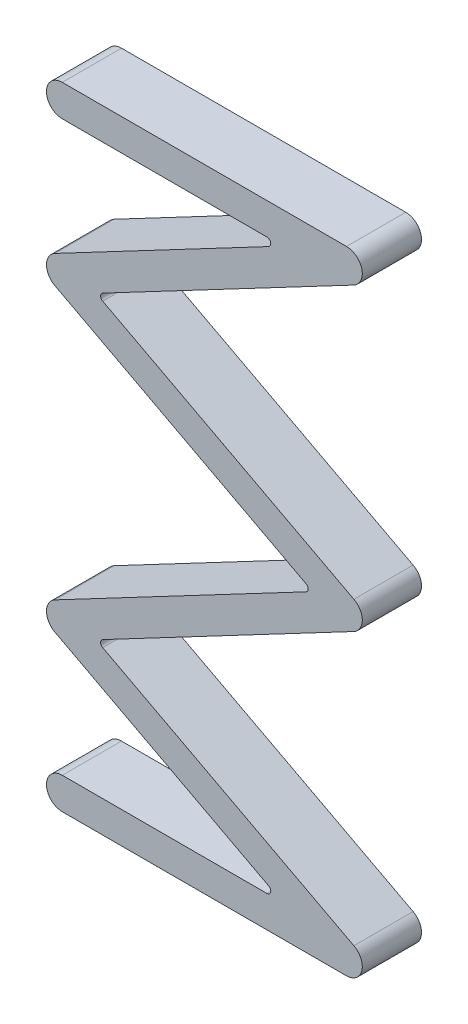
ISO-10303-21;
HEADER;
FILE_DESCRIPTION(('STEP AP214'),'2;1');
FILE_NAME('part.step','',(''),(''),'','','');
FILE_SCHEMA(('AUTOMOTIVE_DESIGN { 1 0 10303 214 1 1 1 1 }'));
ENDSEC;
DATA;
#1=APPLICATION_CONTEXT('core data for automotive mechanical design processes');
#2=APPLICATION_PROTOCOL_DEFINITION('international standard','automotive_design',2000,#1);
#3=PRODUCT_CONTEXT('',#1,'mechanical');
#4=PRODUCT('Part','Part','',(#3));
#5=PRODUCT_RELATED_PRODUCT_CATEGORY('part','',(#4));
#6=PRODUCT_DEFINITION_FORMATION('','',#4);
#7=PRODUCT_DEFINITION_CONTEXT('part definition',#1,'design');
#8=PRODUCT_DEFINITION('design','',#6,#7);
#9=PRODUCT_DEFINITION_SHAPE('','',#8);
#10=(LENGTH_UNIT() NAMED_UNIT(*) SI_UNIT(.MILLI.,.METRE.));
#11=(NAMED_UNIT(*) PLANE_ANGLE_UNIT() SI_UNIT($,.RADIAN.));
#12=(NAMED_UNIT(*) SI_UNIT($,.STERADIAN.) SOLID_ANGLE_UNIT());
#13=UNCERTAINTY_MEASURE_WITH_UNIT(LENGTH_MEASURE(1.E-05),#10,'distance_accuracy_value','');
#14=(GEOMETRIC_REPRESENTATION_CONTEXT(3) GLOBAL_UNCERTAINTY_ASSIGNED_CONTEXT((#13)) GLOBAL_UNIT_ASSIGNED_CONTEXT((#10,
#11,#12)) REPRESENTATION_CONTEXT('',''));
#15=CARTESIAN_POINT('',(0.,0.,0.));
#16=DIRECTION('',(0.,0.,1.));
#17=DIRECTION('',(1.,0.,0.));
#18=AXIS2_PLACEMENT_3D('',#15,#16,#17);
#19=CARTESIAN_POINT('',(0.4,15.6,1.5));
#20=DIRECTION('',(0.,0.,-1.));
#21=DIRECTION('',(-1.,0.,0.));
#22=AXIS2_PLACEMENT_3D('',#19,#20,#21);
#23=CYLINDRICAL_SURFACE('',#22,0.399999999999999);
#24=CARTESIAN_POINT('',(0.4,15.6,0.));
#25=DIRECTION('',(0.,0.,1.));
#26=DIRECTION('',(-1.,0.,0.));
#27=AXIS2_PLACEMENT_3D('',#24,#25,#26);
#28=CIRCLE('',#27,0.399999999999999);
#29=CARTESIAN_POINT('',(0.4,16.,0.));
#30=VERTEX_POINT('',#29);
#31=CARTESIAN_POINT('',(0.4,15.2,0.));
#32=VERTEX_POINT('',#31);
#33=EDGE_CURVE('E214',#30,#32,#28,.T.);
#34=ORIENTED_EDGE('',*,*,#33,.T.);
#35=DIRECTION('',(0.,0.,-1.));
#36=VECTOR('',#35,1.);
#37=CARTESIAN_POINT('',(0.4,15.2,1.5));
#38=LINE('',#37,#36);
#39=CARTESIAN_POINT('',(0.4,15.2,1.5));
#40=VERTEX_POINT('',#39);
#41=EDGE_CURVE('E196',#40,#32,#38,.T.);
#42=ORIENTED_EDGE('',*,*,#41,.F.);
#43=CARTESIAN_POINT('',(0.4,15.6,1.5));
#44=DIRECTION('',(0.,0.,1.));
#45=DIRECTION('',(-1.,0.,0.));
#46=AXIS2_PLACEMENT_3D('',#43,#44,#45);
#47=CIRCLE('',#46,0.399999999999999);
#48=CARTESIAN_POINT('',(0.4,16.,1.5));
#49=VERTEX_POINT('',#48);
#50=EDGE_CURVE('E201',#49,#40,#47,.T.);
#51=ORIENTED_EDGE('',*,*,#50,.F.);
#52=DIRECTION('',(0.,0.,-1.));
#53=VECTOR('',#52,1.);
#54=CARTESIAN_POINT('',(0.4,16.,1.5));
#55=LINE('',#54,#53);
#56=EDGE_CURVE('E368',#49,#30,#55,.T.);
#57=ORIENTED_EDGE('',*,*,#56,.T.);
#58=EDGE_LOOP('',(#34,#42,#51,#57));
#59=FACE_BOUND('',#58,.T.);
#60=ADVANCED_FACE('F35',(#59),#23,.T.);
#61=CARTESIAN_POINT('',(0.4,15.2,1.5));
#62=DIRECTION('',(0.,1.,0.));
#63=DIRECTION('',(0.,0.,1.));
#64=AXIS2_PLACEMENT_3D('',#61,#62,#63);
#65=PLANE('',#64);
#66=DIRECTION('',(1.,0.,0.));
#67=VECTOR('',#66,1.);
#68=CARTESIAN_POINT('',(0.4,15.2,0.));
#69=LINE('',#68,#67);
#70=CARTESIAN_POINT('',(5.58141408226065,15.2,0.));
#71=VERTEX_POINT('',#70);
#72=EDGE_CURVE('E344',#32,#71,#69,.T.);
#73=ORIENTED_EDGE('',*,*,#72,.T.);
#74=DIRECTION('',(0.,0.,-1.));
#75=VECTOR('',#74,1.);
#76=CARTESIAN_POINT('',(5.58141408226065,15.2,1.5));
#77=LINE('',#76,#75);
#78=CARTESIAN_POINT('',(5.58141408226065,15.2,1.5));
#79=VERTEX_POINT('',#78);
#80=EDGE_CURVE('E50',#71,#79,#77,.F.);
#81=ORIENTED_EDGE('',*,*,#80,.T.);
#82=DIRECTION('',(1.,0.,0.));
#83=VECTOR('',#82,1.);
#84=CARTESIAN_POINT('',(0.4,15.2,1.5));
#85=LINE('',#84,#83);
#86=EDGE_CURVE('E192',#40,#79,#85,.T.);
#87=ORIENTED_EDGE('',*,*,#86,.F.);
#88=ORIENTED_EDGE('',*,*,#41,.T.);
#89=EDGE_LOOP('',(#73,#81,#87,#88));
#90=FACE_BOUND('',#89,.T.);
#91=ADVANCED_FACE('F194',(#90),#65,.F.);
#92=CARTESIAN_POINT('',(5.98513126580852,15.2,1.5));
#93=DIRECTION('',(0.466758619558123,-0.884384752846969,0.));
#94=DIRECTION('',(0.88438475284697,0.466758619558123,0.));
#95=AXIS2_PLACEMENT_3D('',#92,#93,#94);
#96=PLANE('',#95);
#97=DIRECTION('',(-0.88438475284697,-0.466758619558123,0.));
#98=VECTOR('',#97,1.);
#99=CARTESIAN_POINT('',(5.98513126580852,15.2,1.5));
#100=LINE('',#99,#98);
#101=CARTESIAN_POINT('',(5.62808994421646,15.0115615247153,1.5));
#102=VERTEX_POINT('',#101);
#103=CARTESIAN_POINT('',(0.21329655217675,12.1537539011388,1.5));
#104=VERTEX_POINT('',#103);
#105=EDGE_CURVE('E200',#102,#104,#100,.T.);
#106=ORIENTED_EDGE('',*,*,#105,.F.);
#107=DIRECTION('',(0.,0.,-1.));
#108=VECTOR('',#107,1.);
#109=CARTESIAN_POINT('',(5.62808994421646,15.0115615247153,0.));
#110=LINE('',#109,#108);
#111=CARTESIAN_POINT('',(5.62808994421646,15.0115615247153,0.));
#112=VERTEX_POINT('',#111);
#113=EDGE_CURVE('E295',#102,#112,#110,.T.);
#114=ORIENTED_EDGE('',*,*,#113,.T.);
#115=DIRECTION('',(-0.88438475284697,-0.466758619558123,0.));
#116=VECTOR('',#115,1.);
#117=CARTESIAN_POINT('',(5.98513126580852,15.2,0.));
#118=LINE('',#117,#116);
#119=CARTESIAN_POINT('',(0.21329655217675,12.1537539011388,0.));
#120=VERTEX_POINT('',#119);
#121=EDGE_CURVE('E340',#112,#120,#118,.T.);
#122=ORIENTED_EDGE('',*,*,#121,.T.);
#123=DIRECTION('',(0.,0.,-1.));
#124=VECTOR('',#123,1.);
#125=CARTESIAN_POINT('',(0.213296552176752,12.1537539011388,1.5));
#126=LINE('',#125,#124);
#127=EDGE_CURVE('E266',#120,#104,#126,.F.);
#128=ORIENTED_EDGE('',*,*,#127,.T.);
#129=EDGE_LOOP('',(#106,#114,#122,#128));
#130=FACE_BOUND('',#129,.T.);
#131=ADVANCED_FACE('F409',(#130),#96,.F.);
#132=CARTESIAN_POINT('',(-0.456973997349374,11.8,1.5));
#133=DIRECTION('',(0.466758619558123,0.88438475284697,0.));
#134=DIRECTION('',(-0.88438475284697,0.466758619558123,0.));
#135=AXIS2_PLACEMENT_3D('',#132,#133,#134);
#136=PLANE('',#135);
#137=DIRECTION('',(0.88438475284697,-0.466758619558123,0.));
#138=VECTOR('',#137,1.);
#139=CARTESIAN_POINT('',(-0.456973997349374,11.8,0.));
#140=LINE('',#139,#138);
#141=CARTESIAN_POINT('',(0.21329655217675,11.4462460988612,0.));
#142=VERTEX_POINT('',#141);
#143=CARTESIAN_POINT('',(6.57545836526909,8.0884384752847,0.));
#144=VERTEX_POINT('',#143);
#145=EDGE_CURVE('E335',#142,#144,#140,.T.);
#146=ORIENTED_EDGE('',*,*,#145,.T.);
#147=DIRECTION('',(0.,0.,-1.));
#148=VECTOR('',#147,1.);
#149=CARTESIAN_POINT('',(6.5754583652691,8.0884384752847,1.5));
#150=LINE('',#149,#148);
#151=CARTESIAN_POINT('',(6.57545836526909,8.0884384752847,1.5));
#152=VERTEX_POINT('',#151);
#153=EDGE_CURVE('E293',#144,#152,#150,.F.);
#154=ORIENTED_EDGE('',*,*,#153,.T.);
#155=DIRECTION('',(0.88438475284697,-0.466758619558123,0.));
#156=VECTOR('',#155,1.);
#157=CARTESIAN_POINT('',(-0.456973997349374,11.8,1.5));
#158=LINE('',#157,#156);
#159=CARTESIAN_POINT('',(0.21329655217675,11.4462460988612,1.5));
#160=VERTEX_POINT('',#159);
#161=EDGE_CURVE('E319',#160,#152,#158,.T.);
#162=ORIENTED_EDGE('',*,*,#161,.F.);
#163=DIRECTION('',(0.,0.,-1.));
#164=VECTOR('',#163,1.);
#165=CARTESIAN_POINT('',(0.21329655217675,11.4462460988612,1.5));
#166=LINE('',#165,#164);
#167=EDGE_CURVE('E263',#160,#142,#166,.T.);
#168=ORIENTED_EDGE('',*,*,#167,.T.);
#169=EDGE_LOOP('',(#146,#154,#162,#168));
#170=FACE_BOUND('',#169,.T.);
#171=ADVANCED_FACE('F338',(#170),#136,.F.);
#172=CARTESIAN_POINT('',(6.74302600265063,8.,1.5));
#173=DIRECTION('',(0.466758619558123,-0.884384752846969,0.));
#174=DIRECTION('',(0.884384752846969,0.466758619558123,0.));
#175=AXIS2_PLACEMENT_3D('',#172,#173,#174);
#176=PLANE('',#175);
#177=DIRECTION('',(-0.884384752846969,-0.466758619558123,0.));
#178=VECTOR('',#177,1.);
#179=CARTESIAN_POINT('',(6.74302600265063,8.,1.5));
#180=LINE('',#179,#178);
#181=CARTESIAN_POINT('',(6.5754583652691,7.9115615247153,1.5));
#182=VERTEX_POINT('',#181);
#183=CARTESIAN_POINT('',(0.213296552176751,4.55375390113879,1.5));
#184=VERTEX_POINT('',#183);
#185=EDGE_CURVE('E317',#182,#184,#180,.T.);
#186=ORIENTED_EDGE('',*,*,#185,.F.);
#187=DIRECTION('',(0.,0.,-1.));
#188=VECTOR('',#187,1.);
#189=CARTESIAN_POINT('',(6.5754583652691,7.9115615247153,0.));
#190=LINE('',#189,#188);
#191=CARTESIAN_POINT('',(6.5754583652691,7.9115615247153,0.));
#192=VERTEX_POINT('',#191);
#193=EDGE_CURVE('E290',#182,#192,#190,.T.);
#194=ORIENTED_EDGE('',*,*,#193,.T.);
#195=DIRECTION('',(-0.884384752846969,-0.466758619558123,0.));
#196=VECTOR('',#195,1.);
#197=CARTESIAN_POINT('',(6.74302600265063,8.,0.));
#198=LINE('',#197,#196);
#199=CARTESIAN_POINT('',(0.213296552176751,4.55375390113879,0.));
#200=VERTEX_POINT('',#199);
#201=EDGE_CURVE('E336',#192,#200,#198,.T.);
#202=ORIENTED_EDGE('',*,*,#201,.T.);
#203=DIRECTION('',(0.,0.,-1.));
#204=VECTOR('',#203,1.);
#205=CARTESIAN_POINT('',(0.21329655217675,4.55375390113879,1.5));
#206=LINE('',#205,#204);
#207=EDGE_CURVE('E272',#200,#184,#206,.F.);
#208=ORIENTED_EDGE('',*,*,#207,.T.);
#209=EDGE_LOOP('',(#186,#194,#202,#208));
#210=FACE_BOUND('',#209,.T.);
#211=ADVANCED_FACE('F324',(#210),#176,.F.);
#212=CARTESIAN_POINT('',(-0.456973997349375,4.2,1.5));
#213=DIRECTION('',(0.466758619558123,0.88438475284697,0.));
#214=DIRECTION('',(-0.88438475284697,0.466758619558123,0.));
#215=AXIS2_PLACEMENT_3D('',#212,#213,#214);
#216=PLANE('',#215);
#217=DIRECTION('',(0.88438475284697,-0.466758619558123,0.));
#218=VECTOR('',#217,1.);
#219=CARTESIAN_POINT('',(-0.456973997349375,4.2,0.));
#220=LINE('',#219,#218);
#221=CARTESIAN_POINT('',(0.21329655217675,3.84624609886121,0.));
#222=VERTEX_POINT('',#221);
#223=CARTESIAN_POINT('',(5.62808994421646,0.988438475284696,0.));
#224=VERTEX_POINT('',#223);
#225=EDGE_CURVE('E342',#222,#224,#220,.T.);
#226=ORIENTED_EDGE('',*,*,#225,.T.);
#227=DIRECTION('',(0.,0.,-1.));
#228=VECTOR('',#227,1.);
#229=CARTESIAN_POINT('',(5.62808994421646,0.988438475284697,1.5));
#230=LINE('',#229,#228);
#231=CARTESIAN_POINT('',(5.62808994421646,0.988438475284696,1.5));
#232=VERTEX_POINT('',#231);
#233=EDGE_CURVE('E278',#224,#232,#230,.F.);
#234=ORIENTED_EDGE('',*,*,#233,.T.);
#235=DIRECTION('',(0.88438475284697,-0.466758619558123,0.));
#236=VECTOR('',#235,1.);
#237=CARTESIAN_POINT('',(-0.456973997349375,4.2,1.5));
#238=LINE('',#237,#236);
#239=CARTESIAN_POINT('',(0.21329655217675,3.84624609886121,1.5));
#240=VERTEX_POINT('',#239);
#241=EDGE_CURVE('E328',#240,#232,#238,.T.);
#242=ORIENTED_EDGE('',*,*,#241,.F.);
#243=DIRECTION('',(0.,0.,-1.));
#244=VECTOR('',#243,1.);
#245=CARTESIAN_POINT('',(0.21329655217675,3.84624609886121,1.5));
#246=LINE('',#245,#244);
#247=EDGE_CURVE('E269',#240,#222,#246,.T.);
#248=ORIENTED_EDGE('',*,*,#247,.T.);
#249=EDGE_LOOP('',(#226,#234,#242,#248));
#250=FACE_BOUND('',#249,.T.);
#251=ADVANCED_FACE('F428',(#250),#216,.F.);
#252=CARTESIAN_POINT('',(0.4,0.8,1.5));
#253=DIRECTION('',(0.,-1.,0.));
#254=DIRECTION('',(0.,0.,-1.));
#255=AXIS2_PLACEMENT_3D('',#252,#253,#254);
#256=PLANE('',#255);
#257=DIRECTION('',(-1.,0.,0.));
#258=VECTOR('',#257,1.);
#259=CARTESIAN_POINT('',(0.4,0.8,1.5));
#260=LINE('',#259,#258);
#261=CARTESIAN_POINT('',(5.58141408226065,0.8,1.5));
#262=VERTEX_POINT('',#261);
#263=CARTESIAN_POINT('',(0.4,0.8,1.5));
#264=VERTEX_POINT('',#263);
#265=EDGE_CURVE('E417',#262,#264,#260,.T.);
#266=ORIENTED_EDGE('',*,*,#265,.F.);
#267=DIRECTION('',(0.,0.,-1.));
#268=VECTOR('',#267,1.);
#269=CARTESIAN_POINT('',(5.58141408226065,0.8,0.));
#270=LINE('',#269,#268);
#271=CARTESIAN_POINT('',(5.58141408226065,0.8,0.));
#272=VERTEX_POINT('',#271);
#273=EDGE_CURVE('E275',#262,#272,#270,.T.);
#274=ORIENTED_EDGE('',*,*,#273,.T.);
#275=DIRECTION('',(-1.,0.,0.));
#276=VECTOR('',#275,1.);
#277=CARTESIAN_POINT('',(0.4,0.8,0.));
#278=LINE('',#277,#276);
#279=CARTESIAN_POINT('',(0.4,0.8,0.));
#280=VERTEX_POINT('',#279);
#281=EDGE_CURVE('E350',#272,#280,#278,.T.);
#282=ORIENTED_EDGE('',*,*,#281,.T.);
#283=DIRECTION('',(0.,0.,-1.));
#284=VECTOR('',#283,1.);
#285=CARTESIAN_POINT('',(0.4,0.8,1.5));
#286=LINE('',#285,#284);
#287=EDGE_CURVE('E216',#264,#280,#286,.T.);
#288=ORIENTED_EDGE('',*,*,#287,.F.);
#289=EDGE_LOOP('',(#266,#274,#282,#288));
#290=FACE_BOUND('',#289,.T.);
#291=ADVANCED_FACE('F422',(#290),#256,.F.);
#292=CARTESIAN_POINT('',(0.4,0.4,1.5));
#293=DIRECTION('',(0.,0.,-1.));
#294=DIRECTION('',(-1.,0.,0.));
#295=AXIS2_PLACEMENT_3D('',#292,#293,#294);
#296=CYLINDRICAL_SURFACE('',#295,0.4);
#297=CARTESIAN_POINT('',(0.4,0.4,0.));
#298=DIRECTION('',(0.,0.,1.));
#299=DIRECTION('',(1.,0.,0.));
#300=AXIS2_PLACEMENT_3D('',#297,#298,#299);
#301=CIRCLE('',#300,0.4);
#302=CARTESIAN_POINT('',(0.4,0.,0.));
#303=VERTEX_POINT('',#302);
#304=EDGE_CURVE('E352',#280,#303,#301,.T.);
#305=ORIENTED_EDGE('',*,*,#304,.T.);
#306=DIRECTION('',(0.,0.,-1.));
#307=VECTOR('',#306,1.);
#308=CARTESIAN_POINT('',(0.4,0.,1.5));
#309=LINE('',#308,#307);
#310=CARTESIAN_POINT('',(0.4,0.,1.5));
#311=VERTEX_POINT('',#310);
#312=EDGE_CURVE('E222',#311,#303,#309,.T.);
#313=ORIENTED_EDGE('',*,*,#312,.F.);
#314=CARTESIAN_POINT('',(0.4,0.4,1.5));
#315=DIRECTION('',(0.,0.,1.));
#316=DIRECTION('',(1.,0.,0.));
#317=AXIS2_PLACEMENT_3D('',#314,#315,#316);
#318=CIRCLE('',#317,0.4);
#319=EDGE_CURVE('E396',#264,#311,#318,.T.);
#320=ORIENTED_EDGE('',*,*,#319,.F.);
#321=ORIENTED_EDGE('',*,*,#287,.T.);
#322=EDGE_LOOP('',(#305,#313,#320,#321));
#323=FACE_BOUND('',#322,.T.);
#324=ADVANCED_FACE('F420',(#323),#296,.T.);
#325=CARTESIAN_POINT('',(0.4,0.,1.5));
#326=DIRECTION('',(0.,1.,0.));
#327=DIRECTION('',(0.,0.,1.));
#328=AXIS2_PLACEMENT_3D('',#325,#326,#327);
#329=PLANE('',#328);
#330=DIRECTION('',(1.,0.,0.));
#331=VECTOR('',#330,1.);
#332=CARTESIAN_POINT('',(0.4,0.,0.));
#333=LINE('',#332,#331);
#334=CARTESIAN_POINT('',(7.6,0.,0.));
#335=VERTEX_POINT('',#334);
#336=EDGE_CURVE('E354',#303,#335,#333,.T.);
#337=ORIENTED_EDGE('',*,*,#336,.T.);
#338=DIRECTION('',(0.,0.,-1.));
#339=VECTOR('',#338,1.);
#340=CARTESIAN_POINT('',(7.6,0.,1.5));
#341=LINE('',#340,#339);
#342=CARTESIAN_POINT('',(7.6,0.,1.5));
#343=VERTEX_POINT('',#342);
#344=EDGE_CURVE('E239',#335,#343,#341,.F.);
#345=ORIENTED_EDGE('',*,*,#344,.T.);
#346=DIRECTION('',(1.,0.,0.));
#347=VECTOR('',#346,1.);
#348=CARTESIAN_POINT('',(0.4,0.,1.5));
#349=LINE('',#348,#347);
#350=EDGE_CURVE('E376',#311,#343,#349,.T.);
#351=ORIENTED_EDGE('',*,*,#350,.F.);
#352=ORIENTED_EDGE('',*,*,#312,.T.);
#353=EDGE_LOOP('',(#337,#345,#351,#352));
#354=FACE_BOUND('',#353,.T.);
#355=ADVANCED_FACE('F374',(#354),#329,.F.);
#356=CARTESIAN_POINT('',(1.25697399734937,4.2,1.5));
#357=DIRECTION('',(-0.466758619558123,-0.88438475284697,0.));
#358=DIRECTION('',(0.88438475284697,-0.466758619558123,0.));
#359=AXIS2_PLACEMENT_3D('',#356,#357,#358);
#360=PLANE('',#359);
#361=DIRECTION('',(-0.88438475284697,0.466758619558123,0.));
#362=VECTOR('',#361,1.);
#363=CARTESIAN_POINT('',(1.25697399734937,4.2,0.));
#364=LINE('',#363,#362);
#365=CARTESIAN_POINT('',(7.78670344782325,0.753753901138788,0.));
#366=VERTEX_POINT('',#365);
#367=CARTESIAN_POINT('',(1.4245416347309,4.1115615247153,0.));
#368=VERTEX_POINT('',#367);
#369=EDGE_CURVE('E357',#366,#368,#364,.T.);
#370=ORIENTED_EDGE('',*,*,#369,.T.);
#371=DIRECTION('',(0.,0.,-1.));
#372=VECTOR('',#371,1.);
#373=CARTESIAN_POINT('',(1.4245416347309,4.1115615247153,1.5));
#374=LINE('',#373,#372);
#375=CARTESIAN_POINT('',(1.4245416347309,4.1115615247153,1.5));
#376=VERTEX_POINT('',#375);
#377=EDGE_CURVE('E283',#368,#376,#374,.F.);
#378=ORIENTED_EDGE('',*,*,#377,.T.);
#379=DIRECTION('',(-0.88438475284697,0.466758619558123,0.));
#380=VECTOR('',#379,1.);
#381=CARTESIAN_POINT('',(1.25697399734937,4.2,1.5));
#382=LINE('',#381,#380);
#383=CARTESIAN_POINT('',(7.78670344782325,0.753753901138788,1.5));
#384=VERTEX_POINT('',#383);
#385=EDGE_CURVE('E390',#384,#376,#382,.T.);
#386=ORIENTED_EDGE('',*,*,#385,.F.);
#387=DIRECTION('',(0.,0.,-1.));
#388=VECTOR('',#387,1.);
#389=CARTESIAN_POINT('',(7.78670344782325,0.753753901138788,1.5));
#390=LINE('',#389,#388);
#391=EDGE_CURVE('E215',#384,#366,#390,.T.);
#392=ORIENTED_EDGE('',*,*,#391,.T.);
#393=EDGE_LOOP('',(#370,#378,#386,#392));
#394=FACE_BOUND('',#393,.T.);
#395=ADVANCED_FACE('F387',(#394),#360,.F.);
#396=CARTESIAN_POINT('',(8.45697399734938,8.,1.5));
#397=DIRECTION('',(-0.466758619558123,0.884384752846969,0.));
#398=DIRECTION('',(-0.884384752846969,-0.466758619558123,0.));
#399=AXIS2_PLACEMENT_3D('',#396,#397,#398);
#400=PLANE('',#399);
#401=DIRECTION('',(0.88438475284697,0.466758619558123,0.));
#402=VECTOR('',#401,1.);
#403=CARTESIAN_POINT('',(8.45697399734938,8.,1.5));
#404=LINE('',#403,#402);
#405=CARTESIAN_POINT('',(1.4245416347309,4.28843847528469,1.5));
#406=VERTEX_POINT('',#405);
#407=CARTESIAN_POINT('',(7.78670344782325,7.64624609886121,1.5));
#408=VERTEX_POINT('',#407);
#409=EDGE_CURVE('E392',#406,#408,#404,.T.);
#410=ORIENTED_EDGE('',*,*,#409,.F.);
#411=DIRECTION('',(0.,0.,-1.));
#412=VECTOR('',#411,1.);
#413=CARTESIAN_POINT('',(1.4245416347309,4.28843847528469,0.));
#414=LINE('',#413,#412);
#415=CARTESIAN_POINT('',(1.4245416347309,4.28843847528469,0.));
#416=VERTEX_POINT('',#415);
#417=EDGE_CURVE('E280',#406,#416,#414,.T.);
#418=ORIENTED_EDGE('',*,*,#417,.T.);
#419=DIRECTION('',(0.88438475284697,0.466758619558123,0.));
#420=VECTOR('',#419,1.);
#421=CARTESIAN_POINT('',(8.45697399734938,8.,0.));
#422=LINE('',#421,#420);
#423=CARTESIAN_POINT('',(7.78670344782325,7.64624609886121,0.));
#424=VERTEX_POINT('',#423);
#425=EDGE_CURVE('E360',#416,#424,#422,.T.);
#426=ORIENTED_EDGE('',*,*,#425,.T.);
#427=DIRECTION('',(0.,0.,-1.));
#428=VECTOR('',#427,1.);
#429=CARTESIAN_POINT('',(7.78670344782325,7.64624609886121,1.5));
#430=LINE('',#429,#428);
#431=EDGE_CURVE('E254',#424,#408,#430,.F.);
#432=ORIENTED_EDGE('',*,*,#431,.T.);
#433=EDGE_LOOP('',(#410,#418,#426,#432));
#434=FACE_BOUND('',#433,.T.);
#435=ADVANCED_FACE('F490',(#434),#400,.F.);
#436=CARTESIAN_POINT('',(1.25697399734937,11.8,1.5));
#437=DIRECTION('',(-0.466758619558123,-0.88438475284697,0.));
#438=DIRECTION('',(0.88438475284697,-0.466758619558123,0.));
#439=AXIS2_PLACEMENT_3D('',#436,#437,#438);
#440=PLANE('',#439);
#441=DIRECTION('',(-0.88438475284697,0.466758619558123,0.));
#442=VECTOR('',#441,1.);
#443=CARTESIAN_POINT('',(1.25697399734937,11.8,0.));
#444=LINE('',#443,#442);
#445=CARTESIAN_POINT('',(7.78670344782325,8.35375390113879,0.));
#446=VERTEX_POINT('',#445);
#447=CARTESIAN_POINT('',(1.4245416347309,11.7115615247153,0.));
#448=VERTEX_POINT('',#447);
#449=EDGE_CURVE('E362',#446,#448,#444,.T.);
#450=ORIENTED_EDGE('',*,*,#449,.T.);
#451=DIRECTION('',(0.,0.,-1.));
#452=VECTOR('',#451,1.);
#453=CARTESIAN_POINT('',(1.4245416347309,11.7115615247153,1.5));
#454=LINE('',#453,#452);
#455=CARTESIAN_POINT('',(1.4245416347309,11.7115615247153,1.5));
#456=VERTEX_POINT('',#455);
#457=EDGE_CURVE('E288',#448,#456,#454,.F.);
#458=ORIENTED_EDGE('',*,*,#457,.T.);
#459=DIRECTION('',(-0.88438475284697,0.466758619558123,0.));
#460=VECTOR('',#459,1.);
#461=CARTESIAN_POINT('',(1.25697399734937,11.8,1.5));
#462=LINE('',#461,#460);
#463=CARTESIAN_POINT('',(7.78670344782325,8.35375390113879,1.5));
#464=VERTEX_POINT('',#463);
#465=EDGE_CURVE('E394',#464,#456,#462,.T.);
#466=ORIENTED_EDGE('',*,*,#465,.F.);
#467=DIRECTION('',(0.,0.,-1.));
#468=VECTOR('',#467,1.);
#469=CARTESIAN_POINT('',(7.78670344782325,8.35375390113879,1.5));
#470=LINE('',#469,#468);
#471=EDGE_CURVE('E251',#464,#446,#470,.T.);
#472=ORIENTED_EDGE('',*,*,#471,.T.);
#473=EDGE_LOOP('',(#450,#458,#466,#472));
#474=FACE_BOUND('',#473,.T.);
#475=ADVANCED_FACE('F483',(#474),#440,.F.);
#476=CARTESIAN_POINT('',(9.21486873419147,16.,1.5));
#477=DIRECTION('',(-0.466758619558123,0.884384752846969,0.));
#478=DIRECTION('',(-0.88438475284697,-0.466758619558123,0.));
#479=AXIS2_PLACEMENT_3D('',#476,#477,#478);
#480=PLANE('',#479);
#481=DIRECTION('',(0.88438475284697,0.466758619558123,0.));
#482=VECTOR('',#481,1.);
#483=CARTESIAN_POINT('',(9.21486873419147,16.,1.5));
#484=LINE('',#483,#482);
#485=CARTESIAN_POINT('',(1.4245416347309,11.8884384752847,1.5));
#486=VERTEX_POINT('',#485);
#487=CARTESIAN_POINT('',(7.78670344782325,15.2462460988612,1.5));
#488=VERTEX_POINT('',#487);
#489=EDGE_CURVE('E402',#486,#488,#484,.T.);
#490=ORIENTED_EDGE('',*,*,#489,.F.);
#491=DIRECTION('',(0.,0.,-1.));
#492=VECTOR('',#491,1.);
#493=CARTESIAN_POINT('',(1.4245416347309,11.8884384752847,0.));
#494=LINE('',#493,#492);
#495=CARTESIAN_POINT('',(1.4245416347309,11.8884384752847,0.));
#496=VERTEX_POINT('',#495);
#497=EDGE_CURVE('E285',#486,#496,#494,.T.);
#498=ORIENTED_EDGE('',*,*,#497,.T.);
#499=DIRECTION('',(0.88438475284697,0.466758619558123,0.));
#500=VECTOR('',#499,1.);
#501=CARTESIAN_POINT('',(9.21486873419147,16.,0.));
#502=LINE('',#501,#500);
#503=CARTESIAN_POINT('',(7.78670344782325,15.2462460988612,0.));
#504=VERTEX_POINT('',#503);
#505=EDGE_CURVE('E365',#496,#504,#502,.T.);
#506=ORIENTED_EDGE('',*,*,#505,.T.);
#507=DIRECTION('',(0.,0.,-1.));
#508=VECTOR('',#507,1.);
#509=CARTESIAN_POINT('',(7.78670344782325,15.2462460988612,1.5));
#510=LINE('',#509,#508);
#511=EDGE_CURVE('E260',#504,#488,#510,.F.);
#512=ORIENTED_EDGE('',*,*,#511,.T.);
#513=EDGE_LOOP('',(#490,#498,#506,#512));
#514=FACE_BOUND('',#513,.T.);
#515=ADVANCED_FACE('F475',(#514),#480,.F.);
#516=CARTESIAN_POINT('',(0.4,16.,1.5));
#517=DIRECTION('',(0.,-1.,0.));
#518=DIRECTION('',(0.,0.,-1.));
#519=AXIS2_PLACEMENT_3D('',#516,#517,#518);
#520=PLANE('',#519);
#521=DIRECTION('',(-1.,0.,0.));
#522=VECTOR('',#521,1.);
#523=CARTESIAN_POINT('',(0.4,16.,1.5));
#524=LINE('',#523,#522);
#525=CARTESIAN_POINT('',(7.6,16.,1.5));
#526=VERTEX_POINT('',#525);
#527=EDGE_CURVE('E207',#526,#49,#524,.T.);
#528=ORIENTED_EDGE('',*,*,#527,.F.);
#529=DIRECTION('',(0.,0.,-1.));
#530=VECTOR('',#529,1.);
#531=CARTESIAN_POINT('',(7.6,16.,1.5));
#532=LINE('',#531,#530);
#533=CARTESIAN_POINT('',(7.6,16.,0.));
#534=VERTEX_POINT('',#533);
#535=EDGE_CURVE('E257',#526,#534,#532,.T.);
#536=ORIENTED_EDGE('',*,*,#535,.T.);
#537=DIRECTION('',(-1.,0.,0.));
#538=VECTOR('',#537,1.);
#539=CARTESIAN_POINT('',(0.4,16.,0.));
#540=LINE('',#539,#538);
#541=EDGE_CURVE('E211',#534,#30,#540,.T.);
#542=ORIENTED_EDGE('',*,*,#541,.T.);
#543=ORIENTED_EDGE('',*,*,#56,.F.);
#544=EDGE_LOOP('',(#528,#536,#542,#543));
#545=FACE_BOUND('',#544,.T.);
#546=ADVANCED_FACE('F470',(#545),#520,.F.);
#547=CARTESIAN_POINT('',(0.4,15.6,1.5));
#548=DIRECTION('',(0.,0.,-1.));
#549=DIRECTION('',(-1.,0.,0.));
#550=AXIS2_PLACEMENT_3D('',#547,#548,#549);
#551=PLANE('',#550);
#552=ORIENTED_EDGE('',*,*,#350,.T.);
#553=CARTESIAN_POINT('',(7.6,0.4,1.5));
#554=DIRECTION('',(0.,0.,-1.));
#555=DIRECTION('',(-1.,0.,0.));
#556=AXIS2_PLACEMENT_3D('',#553,#554,#555);
#557=CIRCLE('',#556,0.4);
#558=EDGE_CURVE('E249',#343,#384,#557,.F.);
#559=ORIENTED_EDGE('',*,*,#558,.T.);
#560=ORIENTED_EDGE('',*,*,#385,.T.);
#561=CARTESIAN_POINT('',(1.47121749668672,4.2,1.5));
#562=DIRECTION('',(0.,0.,-1.));
#563=DIRECTION('',(-1.,0.,0.));
#564=AXIS2_PLACEMENT_3D('',#561,#562,#563);
#565=CIRCLE('',#564,0.1);
#566=EDGE_CURVE('E305',#376,#406,#565,.T.);
#567=ORIENTED_EDGE('',*,*,#566,.T.);
#568=ORIENTED_EDGE('',*,*,#409,.T.);
#569=CARTESIAN_POINT('',(7.6,8.,1.5));
#570=DIRECTION('',(0.,0.,-1.));
#571=DIRECTION('',(-1.,0.,0.));
#572=AXIS2_PLACEMENT_3D('',#569,#570,#571);
#573=CIRCLE('',#572,0.4);
#574=EDGE_CURVE('E247',#408,#464,#573,.F.);
#575=ORIENTED_EDGE('',*,*,#574,.T.);
#576=ORIENTED_EDGE('',*,*,#465,.T.);
#577=CARTESIAN_POINT('',(1.47121749668671,11.8,1.5));
#578=DIRECTION('',(0.,0.,-1.));
#579=DIRECTION('',(-1.,0.,0.));
#580=AXIS2_PLACEMENT_3D('',#577,#578,#579);
#581=CIRCLE('',#580,0.1);
#582=EDGE_CURVE('E309',#456,#486,#581,.T.);
#583=ORIENTED_EDGE('',*,*,#582,.T.);
#584=ORIENTED_EDGE('',*,*,#489,.T.);
#585=CARTESIAN_POINT('',(7.6,15.6,1.5));
#586=DIRECTION('',(0.,0.,-1.));
#587=DIRECTION('',(-1.,0.,0.));
#588=AXIS2_PLACEMENT_3D('',#585,#586,#587);
#589=CIRCLE('',#588,0.4);
#590=EDGE_CURVE('E245',#488,#526,#589,.F.);
#591=ORIENTED_EDGE('',*,*,#590,.T.);
#592=ORIENTED_EDGE('',*,*,#527,.T.);
#593=ORIENTED_EDGE('',*,*,#50,.T.);
#594=ORIENTED_EDGE('',*,*,#86,.T.);
#595=CARTESIAN_POINT('',(5.58141408226065,15.1,1.5));
#596=DIRECTION('',(0.,0.,-1.));
#597=DIRECTION('',(-1.,0.,0.));
#598=AXIS2_PLACEMENT_3D('',#595,#596,#597);
#599=CIRCLE('',#598,0.1);
#600=EDGE_CURVE('E11',#79,#102,#599,.T.);
#601=ORIENTED_EDGE('',*,*,#600,.T.);
#602=ORIENTED_EDGE('',*,*,#105,.T.);
#603=CARTESIAN_POINT('',(0.4,11.8,1.5));
#604=DIRECTION('',(0.,0.,-1.));
#605=DIRECTION('',(-1.,0.,0.));
#606=AXIS2_PLACEMENT_3D('',#603,#604,#605);
#607=CIRCLE('',#606,0.4);
#608=EDGE_CURVE('E243',#104,#160,#607,.F.);
#609=ORIENTED_EDGE('',*,*,#608,.T.);
#610=ORIENTED_EDGE('',*,*,#161,.T.);
#611=CARTESIAN_POINT('',(6.52878250331328,8.,1.5));
#612=DIRECTION('',(0.,0.,-1.));
#613=DIRECTION('',(-1.,0.,0.));
#614=AXIS2_PLACEMENT_3D('',#611,#612,#613);
#615=CIRCLE('',#614,0.1);
#616=EDGE_CURVE('E313',#152,#182,#615,.T.);
#617=ORIENTED_EDGE('',*,*,#616,.T.);
#618=ORIENTED_EDGE('',*,*,#185,.T.);
#619=CARTESIAN_POINT('',(0.399999999999999,4.2,1.5));
#620=DIRECTION('',(0.,0.,-1.));
#621=DIRECTION('',(-1.,0.,0.));
#622=AXIS2_PLACEMENT_3D('',#619,#620,#621);
#623=CIRCLE('',#622,0.4);
#624=EDGE_CURVE('E241',#184,#240,#623,.F.);
#625=ORIENTED_EDGE('',*,*,#624,.T.);
#626=ORIENTED_EDGE('',*,*,#241,.T.);
#627=CARTESIAN_POINT('',(5.58141408226065,0.9,1.5));
#628=DIRECTION('',(0.,0.,-1.));
#629=DIRECTION('',(-1.,0.,0.));
#630=AXIS2_PLACEMENT_3D('',#627,#628,#629);
#631=CIRCLE('',#630,0.1);
#632=EDGE_CURVE('E301',#232,#262,#631,.T.);
#633=ORIENTED_EDGE('',*,*,#632,.T.);
#634=ORIENTED_EDGE('',*,*,#265,.T.);
#635=ORIENTED_EDGE('',*,*,#319,.T.);
#636=EDGE_LOOP('',(#552,#559,#560,#567,#568,#575,#576,#583,#584,#591,#592,#593,#594,#601,#602,
#609,#610,#617,#618,#625,#626,#633,#634,#635));
#637=FACE_BOUND('',#636,.T.);
#638=ADVANCED_FACE('F205',(#637),#551,.F.);
#639=CARTESIAN_POINT('',(0.4,15.6,0.));
#640=DIRECTION('',(0.,0.,-1.));
#641=DIRECTION('',(-1.,0.,0.));
#642=AXIS2_PLACEMENT_3D('',#639,#640,#641);
#643=PLANE('',#642);
#644=ORIENTED_EDGE('',*,*,#369,.F.);
#645=CARTESIAN_POINT('',(7.6,0.4,0.));
#646=DIRECTION('',(0.,0.,-1.));
#647=DIRECTION('',(-1.,0.,0.));
#648=AXIS2_PLACEMENT_3D('',#645,#646,#647);
#649=CIRCLE('',#648,0.4);
#650=EDGE_CURVE('E237',#366,#335,#649,.T.);
#651=ORIENTED_EDGE('',*,*,#650,.T.);
#652=ORIENTED_EDGE('',*,*,#336,.F.);
#653=ORIENTED_EDGE('',*,*,#304,.F.);
#654=ORIENTED_EDGE('',*,*,#281,.F.);
#655=CARTESIAN_POINT('',(5.58141408226065,0.9,0.));
#656=DIRECTION('',(0.,0.,-1.));
#657=DIRECTION('',(-1.,0.,0.));
#658=AXIS2_PLACEMENT_3D('',#655,#656,#657);
#659=CIRCLE('',#658,0.1);
#660=EDGE_CURVE('E299',#272,#224,#659,.F.);
#661=ORIENTED_EDGE('',*,*,#660,.T.);
#662=ORIENTED_EDGE('',*,*,#225,.F.);
#663=CARTESIAN_POINT('',(0.399999999999999,4.2,0.));
#664=DIRECTION('',(0.,0.,-1.));
#665=DIRECTION('',(-1.,0.,0.));
#666=AXIS2_PLACEMENT_3D('',#663,#664,#665);
#667=CIRCLE('',#666,0.4);
#668=EDGE_CURVE('E219',#222,#200,#667,.T.);
#669=ORIENTED_EDGE('',*,*,#668,.T.);
#670=ORIENTED_EDGE('',*,*,#201,.F.);
#671=CARTESIAN_POINT('',(6.52878250331328,8.,0.));
#672=DIRECTION('',(0.,0.,-1.));
#673=DIRECTION('',(-1.,0.,0.));
#674=AXIS2_PLACEMENT_3D('',#671,#672,#673);
#675=CIRCLE('',#674,0.1);
#676=EDGE_CURVE('E311',#192,#144,#675,.F.);
#677=ORIENTED_EDGE('',*,*,#676,.T.);
#678=ORIENTED_EDGE('',*,*,#145,.F.);
#679=CARTESIAN_POINT('',(0.4,11.8,0.));
#680=DIRECTION('',(0.,0.,-1.));
#681=DIRECTION('',(-1.,0.,0.));
#682=AXIS2_PLACEMENT_3D('',#679,#680,#681);
#683=CIRCLE('',#682,0.4);
#684=EDGE_CURVE('E228',#142,#120,#683,.T.);
#685=ORIENTED_EDGE('',*,*,#684,.T.);
#686=ORIENTED_EDGE('',*,*,#121,.F.);
#687=CARTESIAN_POINT('',(5.58141408226065,15.1,0.));
#688=DIRECTION('',(0.,0.,-1.));
#689=DIRECTION('',(-1.,0.,0.));
#690=AXIS2_PLACEMENT_3D('',#687,#688,#689);
#691=CIRCLE('',#690,0.1);
#692=EDGE_CURVE('E43',#112,#71,#691,.F.);
#693=ORIENTED_EDGE('',*,*,#692,.T.);
#694=ORIENTED_EDGE('',*,*,#72,.F.);
#695=ORIENTED_EDGE('',*,*,#33,.F.);
#696=ORIENTED_EDGE('',*,*,#541,.F.);
#697=CARTESIAN_POINT('',(7.6,15.6,0.));
#698=DIRECTION('',(0.,0.,-1.));
#699=DIRECTION('',(-1.,0.,0.));
#700=AXIS2_PLACEMENT_3D('',#697,#698,#699);
#701=CIRCLE('',#700,0.4);
#702=EDGE_CURVE('E231',#534,#504,#701,.T.);
#703=ORIENTED_EDGE('',*,*,#702,.T.);
#704=ORIENTED_EDGE('',*,*,#505,.F.);
#705=CARTESIAN_POINT('',(1.47121749668671,11.8,0.));
#706=DIRECTION('',(0.,0.,-1.));
#707=DIRECTION('',(-1.,0.,0.));
#708=AXIS2_PLACEMENT_3D('',#705,#706,#707);
#709=CIRCLE('',#708,0.1);
#710=EDGE_CURVE('E307',#496,#448,#709,.F.);
#711=ORIENTED_EDGE('',*,*,#710,.T.);
#712=ORIENTED_EDGE('',*,*,#449,.F.);
#713=CARTESIAN_POINT('',(7.6,8.,0.));
#714=DIRECTION('',(0.,0.,-1.));
#715=DIRECTION('',(-1.,0.,0.));
#716=AXIS2_PLACEMENT_3D('',#713,#714,#715);
#717=CIRCLE('',#716,0.4);
#718=EDGE_CURVE('E234',#446,#424,#717,.T.);
#719=ORIENTED_EDGE('',*,*,#718,.T.);
#720=ORIENTED_EDGE('',*,*,#425,.F.);
#721=CARTESIAN_POINT('',(1.47121749668672,4.2,0.));
#722=DIRECTION('',(0.,0.,-1.));
#723=DIRECTION('',(-1.,0.,0.));
#724=AXIS2_PLACEMENT_3D('',#721,#722,#723);
#725=CIRCLE('',#724,0.1);
#726=EDGE_CURVE('E303',#416,#368,#725,.F.);
#727=ORIENTED_EDGE('',*,*,#726,.T.);
#728=EDGE_LOOP('',(#644,#651,#652,#653,#654,#661,#662,#669,#670,#677,#678,#685,#686,#693,#694,
#695,#696,#703,#704,#711,#712,#719,#720,#727));
#729=FACE_BOUND('',#728,.T.);
#730=ADVANCED_FACE('F334',(#729),#643,.T.);
#731=CARTESIAN_POINT('',(7.6,0.4,1.5));
#732=DIRECTION('',(0.,0.,-1.));
#733=DIRECTION('',(-1.,0.,0.));
#734=AXIS2_PLACEMENT_3D('',#731,#732,#733);
#735=CYLINDRICAL_SURFACE('',#734,0.4);
#736=ORIENTED_EDGE('',*,*,#558,.F.);
#737=ORIENTED_EDGE('',*,*,#344,.F.);
#738=ORIENTED_EDGE('',*,*,#650,.F.);
#739=ORIENTED_EDGE('',*,*,#391,.F.);
#740=EDGE_LOOP('',(#736,#737,#738,#739));
#741=FACE_BOUND('',#740,.T.);
#742=ADVANCED_FACE('F384',(#741),#735,.T.);
#743=CARTESIAN_POINT('',(7.6,8.,1.5));
#744=DIRECTION('',(0.,0.,-1.));
#745=DIRECTION('',(-1.,0.,0.));
#746=AXIS2_PLACEMENT_3D('',#743,#744,#745);
#747=CYLINDRICAL_SURFACE('',#746,0.4);
#748=ORIENTED_EDGE('',*,*,#574,.F.);
#749=ORIENTED_EDGE('',*,*,#431,.F.);
#750=ORIENTED_EDGE('',*,*,#718,.F.);
#751=ORIENTED_EDGE('',*,*,#471,.F.);
#752=EDGE_LOOP('',(#748,#749,#750,#751));
#753=FACE_BOUND('',#752,.T.);
#754=ADVANCED_FACE('F457',(#753),#747,.T.);
#755=CARTESIAN_POINT('',(7.6,15.6,1.5));
#756=DIRECTION('',(0.,0.,-1.));
#757=DIRECTION('',(-1.,0.,0.));
#758=AXIS2_PLACEMENT_3D('',#755,#756,#757);
#759=CYLINDRICAL_SURFACE('',#758,0.4);
#760=ORIENTED_EDGE('',*,*,#590,.F.);
#761=ORIENTED_EDGE('',*,*,#511,.F.);
#762=ORIENTED_EDGE('',*,*,#702,.F.);
#763=ORIENTED_EDGE('',*,*,#535,.F.);
#764=EDGE_LOOP('',(#760,#761,#762,#763));
#765=FACE_BOUND('',#764,.T.);
#766=ADVANCED_FACE('F444',(#765),#759,.T.);
#767=CARTESIAN_POINT('',(0.4,11.8,1.5));
#768=DIRECTION('',(0.,0.,-1.));
#769=DIRECTION('',(-1.,0.,0.));
#770=AXIS2_PLACEMENT_3D('',#767,#768,#769);
#771=CYLINDRICAL_SURFACE('',#770,0.4);
#772=ORIENTED_EDGE('',*,*,#608,.F.);
#773=ORIENTED_EDGE('',*,*,#127,.F.);
#774=ORIENTED_EDGE('',*,*,#684,.F.);
#775=ORIENTED_EDGE('',*,*,#167,.F.);
#776=EDGE_LOOP('',(#772,#773,#774,#775));
#777=FACE_BOUND('',#776,.T.);
#778=ADVANCED_FACE('F436',(#777),#771,.T.);
#779=CARTESIAN_POINT('',(0.399999999999999,4.2,1.5));
#780=DIRECTION('',(0.,0.,-1.));
#781=DIRECTION('',(-1.,0.,0.));
#782=AXIS2_PLACEMENT_3D('',#779,#780,#781);
#783=CYLINDRICAL_SURFACE('',#782,0.4);
#784=ORIENTED_EDGE('',*,*,#624,.F.);
#785=ORIENTED_EDGE('',*,*,#207,.F.);
#786=ORIENTED_EDGE('',*,*,#668,.F.);
#787=ORIENTED_EDGE('',*,*,#247,.F.);
#788=EDGE_LOOP('',(#784,#785,#786,#787));
#789=FACE_BOUND('',#788,.T.);
#790=ADVANCED_FACE('F434',(#789),#783,.T.);
#791=CARTESIAN_POINT('',(5.58141408226065,0.9,1.5));
#792=DIRECTION('',(0.,0.,1.));
#793=DIRECTION('',(1.,0.,0.));
#794=AXIS2_PLACEMENT_3D('',#791,#792,#793);
#795=CYLINDRICAL_SURFACE('',#794,0.1);
#796=ORIENTED_EDGE('',*,*,#632,.F.);
#797=ORIENTED_EDGE('',*,*,#233,.F.);
#798=ORIENTED_EDGE('',*,*,#660,.F.);
#799=ORIENTED_EDGE('',*,*,#273,.F.);
#800=EDGE_LOOP('',(#796,#797,#798,#799));
#801=FACE_BOUND('',#800,.T.);
#802=ADVANCED_FACE('F432',(#801),#795,.F.);
#803=CARTESIAN_POINT('',(1.47121749668672,4.2,1.5));
#804=DIRECTION('',(0.,0.,1.));
#805=DIRECTION('',(1.,0.,0.));
#806=AXIS2_PLACEMENT_3D('',#803,#804,#805);
#807=CYLINDRICAL_SURFACE('',#806,0.1);
#808=ORIENTED_EDGE('',*,*,#566,.F.);
#809=ORIENTED_EDGE('',*,*,#377,.F.);
#810=ORIENTED_EDGE('',*,*,#726,.F.);
#811=ORIENTED_EDGE('',*,*,#417,.F.);
#812=EDGE_LOOP('',(#808,#809,#810,#811));
#813=FACE_BOUND('',#812,.T.);
#814=ADVANCED_FACE('F442',(#813),#807,.F.);
#815=CARTESIAN_POINT('',(1.47121749668671,11.8,1.5));
#816=DIRECTION('',(0.,0.,1.));
#817=DIRECTION('',(1.,0.,0.));
#818=AXIS2_PLACEMENT_3D('',#815,#816,#817);
#819=CYLINDRICAL_SURFACE('',#818,0.1);
#820=ORIENTED_EDGE('',*,*,#582,.F.);
#821=ORIENTED_EDGE('',*,*,#457,.F.);
#822=ORIENTED_EDGE('',*,*,#710,.F.);
#823=ORIENTED_EDGE('',*,*,#497,.F.);
#824=EDGE_LOOP('',(#820,#821,#822,#823));
#825=FACE_BOUND('',#824,.T.);
#826=ADVANCED_FACE('F479',(#825),#819,.F.);
#827=CARTESIAN_POINT('',(6.52878250331328,8.,1.5));
#828=DIRECTION('',(0.,0.,1.));
#829=DIRECTION('',(1.,0.,0.));
#830=AXIS2_PLACEMENT_3D('',#827,#828,#829);
#831=CYLINDRICAL_SURFACE('',#830,0.1);
#832=ORIENTED_EDGE('',*,*,#616,.F.);
#833=ORIENTED_EDGE('',*,*,#153,.F.);
#834=ORIENTED_EDGE('',*,*,#676,.F.);
#835=ORIENTED_EDGE('',*,*,#193,.F.);
#836=EDGE_LOOP('',(#832,#833,#834,#835));
#837=FACE_BOUND('',#836,.T.);
#838=ADVANCED_FACE('F330',(#837),#831,.F.);
#839=CARTESIAN_POINT('',(5.58141408226065,15.1,1.5));
#840=DIRECTION('',(0.,0.,1.));
#841=DIRECTION('',(1.,0.,0.));
#842=AXIS2_PLACEMENT_3D('',#839,#840,#841);
#843=CYLINDRICAL_SURFACE('',#842,0.1);
#844=ORIENTED_EDGE('',*,*,#600,.F.);
#845=ORIENTED_EDGE('',*,*,#80,.F.);
#846=ORIENTED_EDGE('',*,*,#692,.F.);
#847=ORIENTED_EDGE('',*,*,#113,.F.);
#848=EDGE_LOOP('',(#844,#845,#846,#847));
#849=FACE_BOUND('',#848,.T.);
#850=ADVANCED_FACE('F37',(#849),#843,.F.);
#851=CLOSED_SHELL('',(#60,#91,#131,#171,#211,#251,#291,#324,#355,#395,#435,#475,#515,#546,#638,
#730,#742,#754,#766,#778,#790,#802,#814,#826,#838,#850));
#852=MANIFOLD_SOLID_BREP('B2',#851);
#853=ADVANCED_BREP_SHAPE_REPRESENTATION('',(#18,#852),#14);
#854=SHAPE_DEFINITION_REPRESENTATION(#9,#853);
ENDSEC;
END-ISO-10303-21;
